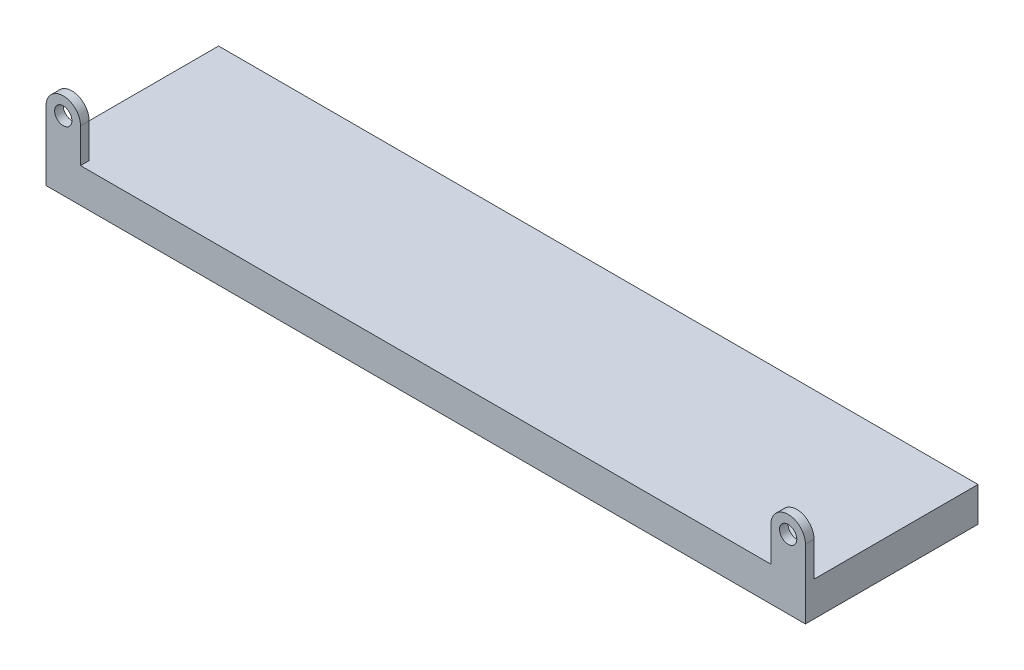
ISO-10303-21;
HEADER;
FILE_DESCRIPTION(('STEP AP214'),'2;1');
FILE_NAME('part.step','',(''),(''),'','','');
FILE_SCHEMA(('AUTOMOTIVE_DESIGN { 1 0 10303 214 1 1 1 1 }'));
ENDSEC;
DATA;
#1=APPLICATION_CONTEXT('core data for automotive mechanical design processes');
#2=APPLICATION_PROTOCOL_DEFINITION('international standard','automotive_design',2000,#1);
#3=PRODUCT_CONTEXT('',#1,'mechanical');
#4=PRODUCT('Part','Part','',(#3));
#5=PRODUCT_RELATED_PRODUCT_CATEGORY('part','',(#4));
#6=PRODUCT_DEFINITION_FORMATION('','',#4);
#7=PRODUCT_DEFINITION_CONTEXT('part definition',#1,'design');
#8=PRODUCT_DEFINITION('design','',#6,#7);
#9=PRODUCT_DEFINITION_SHAPE('','',#8);
#10=(LENGTH_UNIT() NAMED_UNIT(*) SI_UNIT(.MILLI.,.METRE.));
#11=(NAMED_UNIT(*) PLANE_ANGLE_UNIT() SI_UNIT($,.RADIAN.));
#12=(NAMED_UNIT(*) SI_UNIT($,.STERADIAN.) SOLID_ANGLE_UNIT());
#13=UNCERTAINTY_MEASURE_WITH_UNIT(LENGTH_MEASURE(1.E-05),#10,'distance_accuracy_value','');
#14=(GEOMETRIC_REPRESENTATION_CONTEXT(3) GLOBAL_UNCERTAINTY_ASSIGNED_CONTEXT((#13)) GLOBAL_UNIT_ASSIGNED_CONTEXT((#10,
#11,#12)) REPRESENTATION_CONTEXT('',''));
#15=CARTESIAN_POINT('',(0.,0.,0.));
#16=DIRECTION('',(0.,0.,1.));
#17=DIRECTION('',(1.,0.,0.));
#18=AXIS2_PLACEMENT_3D('',#15,#16,#17);
#19=CARTESIAN_POINT('',(-63.5,-127.,-635.));
#20=DIRECTION('',(0.,1.,0.));
#21=DIRECTION('',(0.,0.,1.));
#22=AXIS2_PLACEMENT_3D('',#19,#20,#21);
#23=PLANE('',#22);
#24=DIRECTION('',(0.,0.,1.));
#25=VECTOR('',#24,1.);
#26=CARTESIAN_POINT('',(-63.5,-127.,-635.));
#27=LINE('',#26,#25);
#28=CARTESIAN_POINT('',(-63.5,-127.,-635.));
#29=VERTEX_POINT('',#28);
#30=CARTESIAN_POINT('',(-63.5,-127.,-31.7500000000002));
#31=VERTEX_POINT('',#30);
#32=EDGE_CURVE('E160',#29,#31,#27,.T.);
#33=ORIENTED_EDGE('',*,*,#32,.T.);
#34=DIRECTION('',(1.,0.,0.));
#35=VECTOR('',#34,1.);
#36=CARTESIAN_POINT('',(-63.5,-127.,-31.75));
#37=LINE('',#36,#35);
#38=CARTESIAN_POINT('',(63.5,-127.,-31.7499999999999));
#39=VERTEX_POINT('',#38);
#40=EDGE_CURVE('E52',#31,#39,#37,.T.);
#41=ORIENTED_EDGE('',*,*,#40,.T.);
#42=DIRECTION('',(0.,0.,1.));
#43=VECTOR('',#42,1.);
#44=CARTESIAN_POINT('',(63.5,-127.,-31.75));
#45=LINE('',#44,#43);
#46=CARTESIAN_POINT('',(63.5,-127.,0.));
#47=VERTEX_POINT('',#46);
#48=EDGE_CURVE('E57',#39,#47,#45,.T.);
#49=ORIENTED_EDGE('',*,*,#48,.T.);
#50=DIRECTION('',(-1.,0.,0.));
#51=VECTOR('',#50,1.);
#52=CARTESIAN_POINT('',(-63.5,-127.,0.));
#53=LINE('',#52,#51);
#54=CARTESIAN_POINT('',(2603.5,-127.,0.));
#55=VERTEX_POINT('',#54);
#56=EDGE_CURVE('E149',#55,#47,#53,.T.);
#57=ORIENTED_EDGE('',*,*,#56,.F.);
#58=DIRECTION('',(0.,0.,1.));
#59=VECTOR('',#58,1.);
#60=CARTESIAN_POINT('',(2603.5,-127.,-31.75));
#61=LINE('',#60,#59);
#62=CARTESIAN_POINT('',(2603.5,-127.,-31.75));
#63=VERTEX_POINT('',#62);
#64=EDGE_CURVE('E44',#63,#55,#61,.T.);
#65=ORIENTED_EDGE('',*,*,#64,.F.);
#66=DIRECTION('',(-1.,0.,0.));
#67=VECTOR('',#66,1.);
#68=CARTESIAN_POINT('',(0.,-127.000000000001,-31.75));
#69=LINE('',#68,#67);
#70=CARTESIAN_POINT('',(2730.5,-127.,-31.7500000000002));
#71=VERTEX_POINT('',#70);
#72=EDGE_CURVE('E177',#71,#63,#69,.T.);
#73=ORIENTED_EDGE('',*,*,#72,.F.);
#74=DIRECTION('',(0.,0.,1.));
#75=VECTOR('',#74,1.);
#76=CARTESIAN_POINT('',(2730.5,-127.,-635.));
#77=LINE('',#76,#75);
#78=CARTESIAN_POINT('',(2730.5,-127.,-635.));
#79=VERTEX_POINT('',#78);
#80=EDGE_CURVE('E163',#79,#71,#77,.T.);
#81=ORIENTED_EDGE('',*,*,#80,.F.);
#82=DIRECTION('',(-1.,0.,0.));
#83=VECTOR('',#82,1.);
#84=CARTESIAN_POINT('',(-63.5,-127.,-635.));
#85=LINE('',#84,#83);
#86=EDGE_CURVE('E155',#79,#29,#85,.T.);
#87=ORIENTED_EDGE('',*,*,#86,.T.);
#88=EDGE_LOOP('',(#33,#41,#49,#57,#65,#73,#81,#87));
#89=FACE_BOUND('',#88,.T.);
#90=ADVANCED_FACE('F35',(#89),#23,.T.);
#91=CARTESIAN_POINT('',(2667.,2.61290641066079E-13,-31.75));
#92=DIRECTION('',(0.,0.,1.));
#93=DIRECTION('',(1.,0.,0.));
#94=AXIS2_PLACEMENT_3D('',#91,#92,#93);
#95=CYLINDRICAL_SURFACE('',#94,63.4999999999999);
#96=CARTESIAN_POINT('',(2667.,2.61290641066079E-13,0.));
#97=DIRECTION('',(0.,0.,1.));
#98=DIRECTION('',(1.,0.,0.));
#99=AXIS2_PLACEMENT_3D('',#96,#97,#98);
#100=CIRCLE('',#99,63.4999999999999);
#101=CARTESIAN_POINT('',(2730.5,0.,0.));
#102=VERTEX_POINT('',#101);
#103=CARTESIAN_POINT('',(2603.5,2.55069435326411E-13,0.));
#104=VERTEX_POINT('',#103);
#105=EDGE_CURVE('E162',#102,#104,#100,.T.);
#106=ORIENTED_EDGE('',*,*,#105,.F.);
#107=DIRECTION('',(0.,0.,1.));
#108=VECTOR('',#107,1.);
#109=CARTESIAN_POINT('',(2730.5,0.,-31.75));
#110=LINE('',#109,#108);
#111=CARTESIAN_POINT('',(2730.5,0.,-31.75));
#112=VERTEX_POINT('',#111);
#113=EDGE_CURVE('E11',#112,#102,#110,.T.);
#114=ORIENTED_EDGE('',*,*,#113,.F.);
#115=CARTESIAN_POINT('',(2667.,2.61290641066079E-13,-31.75));
#116=DIRECTION('',(0.,0.,1.));
#117=DIRECTION('',(1.,0.,0.));
#118=AXIS2_PLACEMENT_3D('',#115,#116,#117);
#119=CIRCLE('',#118,63.4999999999999);
#120=CARTESIAN_POINT('',(2603.5,2.55069435326411E-13,-31.75));
#121=VERTEX_POINT('',#120);
#122=EDGE_CURVE('E170',#112,#121,#119,.T.);
#123=ORIENTED_EDGE('',*,*,#122,.T.);
#124=DIRECTION('',(0.,0.,1.));
#125=VECTOR('',#124,1.);
#126=CARTESIAN_POINT('',(2603.5,2.55069435326411E-13,-31.75));
#127=LINE('',#126,#125);
#128=EDGE_CURVE('E183',#121,#104,#127,.T.);
#129=ORIENTED_EDGE('',*,*,#128,.T.);
#130=EDGE_LOOP('',(#106,#114,#123,#129));
#131=FACE_BOUND('',#130,.T.);
#132=ADVANCED_FACE('F37',(#131),#95,.T.);
#133=CARTESIAN_POINT('',(2730.5,0.,-31.75));
#134=DIRECTION('',(-1.,0.,0.));
#135=DIRECTION('',(0.,0.,1.));
#136=AXIS2_PLACEMENT_3D('',#133,#134,#135);
#137=PLANE('',#136);
#138=DIRECTION('',(0.,-1.,0.));
#139=VECTOR('',#138,1.);
#140=CARTESIAN_POINT('',(2730.5,0.,0.));
#141=LINE('',#140,#139);
#142=CARTESIAN_POINT('',(2730.5,-254.,0.));
#143=VERTEX_POINT('',#142);
#144=EDGE_CURVE('E174',#102,#143,#141,.T.);
#145=ORIENTED_EDGE('',*,*,#144,.T.);
#146=DIRECTION('',(0.,0.,1.));
#147=VECTOR('',#146,1.);
#148=CARTESIAN_POINT('',(2730.5,-254.,-635.));
#149=LINE('',#148,#147);
#150=CARTESIAN_POINT('',(2730.5,-254.,-635.));
#151=VERTEX_POINT('',#150);
#152=EDGE_CURVE('E166',#151,#143,#149,.T.);
#153=ORIENTED_EDGE('',*,*,#152,.F.);
#154=DIRECTION('',(0.,1.,0.));
#155=VECTOR('',#154,1.);
#156=CARTESIAN_POINT('',(2730.5,-127.,-635.));
#157=LINE('',#156,#155);
#158=EDGE_CURVE('E152',#151,#79,#157,.T.);
#159=ORIENTED_EDGE('',*,*,#158,.T.);
#160=ORIENTED_EDGE('',*,*,#80,.T.);
#161=DIRECTION('',(0.,-1.,0.));
#162=VECTOR('',#161,1.);
#163=CARTESIAN_POINT('',(2730.5,0.,-31.75));
#164=LINE('',#163,#162);
#165=EDGE_CURVE('E180',#112,#71,#164,.T.);
#166=ORIENTED_EDGE('',*,*,#165,.F.);
#167=ORIENTED_EDGE('',*,*,#113,.T.);
#168=EDGE_LOOP('',(#145,#153,#159,#160,#166,#167));
#169=FACE_BOUND('',#168,.T.);
#170=ADVANCED_FACE('F199',(#169),#137,.F.);
#171=CARTESIAN_POINT('',(2603.5,0.,-31.75));
#172=DIRECTION('',(-1.,0.,0.));
#173=DIRECTION('',(0.,0.,1.));
#174=AXIS2_PLACEMENT_3D('',#171,#172,#173);
#175=PLANE('',#174);
#176=DIRECTION('',(0.,-1.,0.));
#177=VECTOR('',#176,1.);
#178=CARTESIAN_POINT('',(2603.5,0.,0.));
#179=LINE('',#178,#177);
#180=EDGE_CURVE('E185',#104,#55,#179,.T.);
#181=ORIENTED_EDGE('',*,*,#180,.F.);
#182=ORIENTED_EDGE('',*,*,#128,.F.);
#183=DIRECTION('',(0.,-1.,0.));
#184=VECTOR('',#183,1.);
#185=CARTESIAN_POINT('',(2603.5,0.,-31.75));
#186=LINE('',#185,#184);
#187=EDGE_CURVE('E173',#121,#63,#186,.T.);
#188=ORIENTED_EDGE('',*,*,#187,.T.);
#189=ORIENTED_EDGE('',*,*,#64,.T.);
#190=EDGE_LOOP('',(#181,#182,#188,#189));
#191=FACE_BOUND('',#190,.T.);
#192=ADVANCED_FACE('F196',(#191),#175,.T.);
#193=CARTESIAN_POINT('',(0.,0.,-31.75));
#194=DIRECTION('',(0.,0.,1.));
#195=DIRECTION('',(1.,0.,0.));
#196=AXIS2_PLACEMENT_3D('',#193,#194,#195);
#197=PLANE('',#196);
#198=CARTESIAN_POINT('',(2667.,2.61290641066079E-13,-31.7499999999999));
#199=DIRECTION('',(0.,0.,1.));
#200=DIRECTION('',(1.,0.,0.));
#201=AXIS2_PLACEMENT_3D('',#198,#199,#200);
#202=CIRCLE('',#201,31.7500000000004);
#203=CARTESIAN_POINT('',(2698.75,2.61290641066079E-13,-31.7500000000001));
#204=VERTEX_POINT('',#203);
#205=EDGE_CURVE('E134',#204,#204,#202,.T.);
#206=ORIENTED_EDGE('',*,*,#205,.T.);
#207=EDGE_LOOP('',(#206));
#208=FACE_BOUND('',#207,.T.);
#209=ORIENTED_EDGE('',*,*,#122,.F.);
#210=ORIENTED_EDGE('',*,*,#165,.T.);
#211=ORIENTED_EDGE('',*,*,#72,.T.);
#212=ORIENTED_EDGE('',*,*,#187,.F.);
#213=EDGE_LOOP('',(#209,#210,#211,#212));
#214=FACE_BOUND('',#213,.T.);
#215=ADVANCED_FACE('F256',(#208,#214),#197,.F.);
#216=CARTESIAN_POINT('',(0.,0.,0.));
#217=DIRECTION('',(0.,0.,1.));
#218=DIRECTION('',(1.,0.,0.));
#219=AXIS2_PLACEMENT_3D('',#216,#217,#218);
#220=PLANE('',#219);
#221=CARTESIAN_POINT('',(0.,0.,0.));
#222=DIRECTION('',(0.,0.,1.));
#223=DIRECTION('',(1.,0.,0.));
#224=AXIS2_PLACEMENT_3D('',#221,#222,#223);
#225=CIRCLE('',#224,31.75);
#226=CARTESIAN_POINT('',(31.75,0.,-1.11022302462516E-13));
#227=VERTEX_POINT('',#226);
#228=EDGE_CURVE('E225',#227,#227,#225,.T.);
#229=ORIENTED_EDGE('',*,*,#228,.F.);
#230=EDGE_LOOP('',(#229));
#231=FACE_BOUND('',#230,.T.);
#232=CARTESIAN_POINT('',(2667.,2.61290641066079E-13,0.));
#233=DIRECTION('',(0.,0.,1.));
#234=DIRECTION('',(1.,0.,0.));
#235=AXIS2_PLACEMENT_3D('',#232,#233,#234);
#236=CIRCLE('',#235,31.7500000000004);
#237=CARTESIAN_POINT('',(2698.75,2.61290641066079E-13,-1.11022302462516E-13));
#238=VERTEX_POINT('',#237);
#239=EDGE_CURVE('E222',#238,#238,#236,.T.);
#240=ORIENTED_EDGE('',*,*,#239,.F.);
#241=EDGE_LOOP('',(#240));
#242=FACE_BOUND('',#241,.T.);
#243=ORIENTED_EDGE('',*,*,#105,.T.);
#244=ORIENTED_EDGE('',*,*,#180,.T.);
#245=ORIENTED_EDGE('',*,*,#56,.T.);
#246=DIRECTION('',(0.,-1.,0.));
#247=VECTOR('',#246,1.);
#248=CARTESIAN_POINT('',(63.5,0.,0.));
#249=LINE('',#248,#247);
#250=CARTESIAN_POINT('',(63.5,0.,0.));
#251=VERTEX_POINT('',#250);
#252=EDGE_CURVE('E124',#251,#47,#249,.T.);
#253=ORIENTED_EDGE('',*,*,#252,.F.);
#254=CARTESIAN_POINT('',(0.,0.,0.));
#255=DIRECTION('',(0.,0.,1.));
#256=DIRECTION('',(1.,0.,0.));
#257=AXIS2_PLACEMENT_3D('',#254,#255,#256);
#258=CIRCLE('',#257,63.5);
#259=CARTESIAN_POINT('',(-63.5,0.,0.));
#260=VERTEX_POINT('',#259);
#261=EDGE_CURVE('E130',#251,#260,#258,.T.);
#262=ORIENTED_EDGE('',*,*,#261,.T.);
#263=DIRECTION('',(0.,-1.,0.));
#264=VECTOR('',#263,1.);
#265=CARTESIAN_POINT('',(-63.5,-127.,0.));
#266=LINE('',#265,#264);
#267=CARTESIAN_POINT('',(-63.5,-254.,0.));
#268=VERTEX_POINT('',#267);
#269=EDGE_CURVE('E111',#260,#268,#266,.T.);
#270=ORIENTED_EDGE('',*,*,#269,.T.);
#271=DIRECTION('',(1.,0.,0.));
#272=VECTOR('',#271,1.);
#273=CARTESIAN_POINT('',(-63.5,-254.,0.));
#274=LINE('',#273,#272);
#275=EDGE_CURVE('E123',#268,#143,#274,.T.);
#276=ORIENTED_EDGE('',*,*,#275,.T.);
#277=ORIENTED_EDGE('',*,*,#144,.F.);
#278=EDGE_LOOP('',(#243,#244,#245,#253,#262,#270,#276,#277));
#279=FACE_BOUND('',#278,.T.);
#280=ADVANCED_FACE('F138',(#231,#242,#279),#220,.T.);
#281=CARTESIAN_POINT('',(-63.5,-127.,-635.));
#282=DIRECTION('',(-1.,0.,0.));
#283=DIRECTION('',(0.,-1.,0.));
#284=AXIS2_PLACEMENT_3D('',#281,#282,#283);
#285=PLANE('',#284);
#286=ORIENTED_EDGE('',*,*,#269,.F.);
#287=DIRECTION('',(0.,0.,1.));
#288=VECTOR('',#287,1.);
#289=CARTESIAN_POINT('',(-63.5,0.,-31.75));
#290=LINE('',#289,#288);
#291=CARTESIAN_POINT('',(-63.5,0.,-31.75));
#292=VERTEX_POINT('',#291);
#293=EDGE_CURVE('E115',#292,#260,#290,.T.);
#294=ORIENTED_EDGE('',*,*,#293,.F.);
#295=DIRECTION('',(0.,-1.,0.));
#296=VECTOR('',#295,1.);
#297=CARTESIAN_POINT('',(-63.5,0.,-31.75));
#298=LINE('',#297,#296);
#299=EDGE_CURVE('E141',#292,#31,#298,.T.);
#300=ORIENTED_EDGE('',*,*,#299,.T.);
#301=ORIENTED_EDGE('',*,*,#32,.F.);
#302=DIRECTION('',(0.,-1.,0.));
#303=VECTOR('',#302,1.);
#304=CARTESIAN_POINT('',(-63.5,-127.,-635.));
#305=LINE('',#304,#303);
#306=CARTESIAN_POINT('',(-63.5,-254.,-635.));
#307=VERTEX_POINT('',#306);
#308=EDGE_CURVE('E146',#29,#307,#305,.T.);
#309=ORIENTED_EDGE('',*,*,#308,.T.);
#310=DIRECTION('',(0.,0.,1.));
#311=VECTOR('',#310,1.);
#312=CARTESIAN_POINT('',(-63.5,-254.,-635.));
#313=LINE('',#312,#311);
#314=EDGE_CURVE('E118',#307,#268,#313,.T.);
#315=ORIENTED_EDGE('',*,*,#314,.T.);
#316=EDGE_LOOP('',(#286,#294,#300,#301,#309,#315));
#317=FACE_BOUND('',#316,.T.);
#318=ADVANCED_FACE('F113',(#317),#285,.T.);
#319=CARTESIAN_POINT('',(-63.5,-254.,-635.));
#320=DIRECTION('',(0.,-1.,0.));
#321=DIRECTION('',(0.,0.,-1.));
#322=AXIS2_PLACEMENT_3D('',#319,#320,#321);
#323=PLANE('',#322);
#324=ORIENTED_EDGE('',*,*,#275,.F.);
#325=ORIENTED_EDGE('',*,*,#314,.F.);
#326=DIRECTION('',(1.,0.,0.));
#327=VECTOR('',#326,1.);
#328=CARTESIAN_POINT('',(-63.5,-254.,-635.));
#329=LINE('',#328,#327);
#330=EDGE_CURVE('E148',#307,#151,#329,.T.);
#331=ORIENTED_EDGE('',*,*,#330,.T.);
#332=ORIENTED_EDGE('',*,*,#152,.T.);
#333=EDGE_LOOP('',(#324,#325,#331,#332));
#334=FACE_BOUND('',#333,.T.);
#335=ADVANCED_FACE('F203',(#334),#323,.T.);
#336=CARTESIAN_POINT('',(0.,0.,-635.));
#337=DIRECTION('',(0.,0.,1.));
#338=DIRECTION('',(1.,0.,0.));
#339=AXIS2_PLACEMENT_3D('',#336,#337,#338);
#340=PLANE('',#339);
#341=ORIENTED_EDGE('',*,*,#308,.F.);
#342=ORIENTED_EDGE('',*,*,#86,.F.);
#343=ORIENTED_EDGE('',*,*,#158,.F.);
#344=ORIENTED_EDGE('',*,*,#330,.F.);
#345=EDGE_LOOP('',(#341,#342,#343,#344));
#346=FACE_BOUND('',#345,.T.);
#347=ADVANCED_FACE('F207',(#346),#340,.F.);
#348=CARTESIAN_POINT('',(0.,0.,-31.75));
#349=DIRECTION('',(0.,0.,1.));
#350=DIRECTION('',(1.,0.,0.));
#351=AXIS2_PLACEMENT_3D('',#348,#349,#350);
#352=CYLINDRICAL_SURFACE('',#351,63.5);
#353=ORIENTED_EDGE('',*,*,#261,.F.);
#354=DIRECTION('',(0.,0.,1.));
#355=VECTOR('',#354,1.);
#356=CARTESIAN_POINT('',(63.5,0.,-31.75));
#357=LINE('',#356,#355);
#358=CARTESIAN_POINT('',(63.5,0.,-31.75));
#359=VERTEX_POINT('',#358);
#360=EDGE_CURVE('E133',#359,#251,#357,.T.);
#361=ORIENTED_EDGE('',*,*,#360,.F.);
#362=CARTESIAN_POINT('',(0.,0.,-31.75));
#363=DIRECTION('',(0.,0.,1.));
#364=DIRECTION('',(1.,0.,0.));
#365=AXIS2_PLACEMENT_3D('',#362,#363,#364);
#366=CIRCLE('',#365,63.5);
#367=EDGE_CURVE('E132',#359,#292,#366,.T.);
#368=ORIENTED_EDGE('',*,*,#367,.T.);
#369=ORIENTED_EDGE('',*,*,#293,.T.);
#370=EDGE_LOOP('',(#353,#361,#368,#369));
#371=FACE_BOUND('',#370,.T.);
#372=ADVANCED_FACE('F129',(#371),#352,.T.);
#373=CARTESIAN_POINT('',(0.,0.,-31.75));
#374=DIRECTION('',(0.,0.,1.));
#375=DIRECTION('',(1.,0.,0.));
#376=AXIS2_PLACEMENT_3D('',#373,#374,#375);
#377=PLANE('',#376);
#378=CARTESIAN_POINT('',(0.,0.,-31.7499999999999));
#379=DIRECTION('',(0.,0.,1.));
#380=DIRECTION('',(1.,0.,0.));
#381=AXIS2_PLACEMENT_3D('',#378,#379,#380);
#382=CIRCLE('',#381,31.75);
#383=CARTESIAN_POINT('',(31.75,0.,-31.7500000000001));
#384=VERTEX_POINT('',#383);
#385=EDGE_CURVE('E39',#384,#384,#382,.T.);
#386=ORIENTED_EDGE('',*,*,#385,.T.);
#387=EDGE_LOOP('',(#386));
#388=FACE_BOUND('',#387,.T.);
#389=ORIENTED_EDGE('',*,*,#367,.F.);
#390=DIRECTION('',(0.,-1.,0.));
#391=VECTOR('',#390,1.);
#392=CARTESIAN_POINT('',(63.5,0.,-31.75));
#393=LINE('',#392,#391);
#394=EDGE_CURVE('E212',#359,#39,#393,.T.);
#395=ORIENTED_EDGE('',*,*,#394,.T.);
#396=ORIENTED_EDGE('',*,*,#40,.F.);
#397=ORIENTED_EDGE('',*,*,#299,.F.);
#398=EDGE_LOOP('',(#389,#395,#396,#397));
#399=FACE_BOUND('',#398,.T.);
#400=ADVANCED_FACE('F210',(#388,#399),#377,.F.);
#401=CARTESIAN_POINT('',(63.5,0.,-31.75));
#402=DIRECTION('',(-1.,0.,0.));
#403=DIRECTION('',(0.,-1.,0.));
#404=AXIS2_PLACEMENT_3D('',#401,#402,#403);
#405=PLANE('',#404);
#406=ORIENTED_EDGE('',*,*,#252,.T.);
#407=ORIENTED_EDGE('',*,*,#48,.F.);
#408=ORIENTED_EDGE('',*,*,#394,.F.);
#409=ORIENTED_EDGE('',*,*,#360,.T.);
#410=EDGE_LOOP('',(#406,#407,#408,#409));
#411=FACE_BOUND('',#410,.T.);
#412=ADVANCED_FACE('F218',(#411),#405,.F.);
#413=CARTESIAN_POINT('',(0.,0.,-635.));
#414=DIRECTION('',(0.,0.,1.));
#415=DIRECTION('',(1.,0.,0.));
#416=AXIS2_PLACEMENT_3D('',#413,#414,#415);
#417=CYLINDRICAL_SURFACE('',#416,31.75);
#418=CARTESIAN_POINT('',(31.75,0.,-1.11022302462516E-13));
#419=CARTESIAN_POINT('',(31.75,0.,-0.330729166666765));
#420=CARTESIAN_POINT('',(31.75,0.,-0.66145833333342));
#421=CARTESIAN_POINT('',(31.75,0.,-1.32291666666677));
#422=CARTESIAN_POINT('',(31.75,0.,-1.65364583333346));
#423=CARTESIAN_POINT('',(31.75,0.,-2.3151041666668));
#424=CARTESIAN_POINT('',(31.75,0.,-2.64583333333346));
#425=CARTESIAN_POINT('',(31.75,0.,-3.30729166666677));
#426=CARTESIAN_POINT('',(31.75,0.,-3.63802083333342));
#427=CARTESIAN_POINT('',(31.75,0.,-4.29947916666677));
#428=CARTESIAN_POINT('',(31.75,0.,-4.63020833333346));
#429=CARTESIAN_POINT('',(31.75,0.,-5.29166666666681));
#430=CARTESIAN_POINT('',(31.75,0.,-5.62239583333346));
#431=CARTESIAN_POINT('',(31.75,0.,-6.28385416666677));
#432=CARTESIAN_POINT('',(31.75,0.,-6.61458333333342));
#433=CARTESIAN_POINT('',(31.75,0.,-7.27604166666673));
#434=CARTESIAN_POINT('',(31.75,0.,-7.60677083333339));
#435=CARTESIAN_POINT('',(31.75,0.,-8.26822916666673));
#436=CARTESIAN_POINT('',(31.75,0.,-8.59895833333342));
#437=CARTESIAN_POINT('',(31.75,0.,-9.26041666666677));
#438=CARTESIAN_POINT('',(31.75,0.,-9.59114583333342));
#439=CARTESIAN_POINT('',(31.75,0.,-10.2526041666667));
#440=CARTESIAN_POINT('',(31.75,0.,-10.5833333333334));
#441=CARTESIAN_POINT('',(31.75,0.,-11.2447916666667));
#442=CARTESIAN_POINT('',(31.75,0.,-11.5755208333334));
#443=CARTESIAN_POINT('',(31.75,0.,-12.2369791666668));
#444=CARTESIAN_POINT('',(31.75,0.,-12.5677083333334));
#445=CARTESIAN_POINT('',(31.75,0.,-13.2291666666667));
#446=CARTESIAN_POINT('',(31.75,0.,-13.5598958333334));
#447=CARTESIAN_POINT('',(31.75,0.,-14.2213541666667));
#448=CARTESIAN_POINT('',(31.75,0.,-14.5520833333334));
#449=CARTESIAN_POINT('',(31.75,0.,-15.2135416666668));
#450=CARTESIAN_POINT('',(31.75,0.,-15.5442708333334));
#451=CARTESIAN_POINT('',(31.75,0.,-16.2057291666667));
#452=CARTESIAN_POINT('',(31.75,0.,-16.5364583333334));
#453=CARTESIAN_POINT('',(31.75,0.,-17.1979166666667));
#454=CARTESIAN_POINT('',(31.75,0.,-17.5286458333334));
#455=CARTESIAN_POINT('',(31.75,0.,-18.1901041666668));
#456=CARTESIAN_POINT('',(31.75,0.,-18.5208333333334));
#457=CARTESIAN_POINT('',(31.75,0.,-19.1822916666667));
#458=CARTESIAN_POINT('',(31.75,0.,-19.5130208333334));
#459=CARTESIAN_POINT('',(31.75,0.,-20.1744791666667));
#460=CARTESIAN_POINT('',(31.75,0.,-20.5052083333334));
#461=CARTESIAN_POINT('',(31.75,0.,-21.1666666666668));
#462=CARTESIAN_POINT('',(31.75,0.,-21.4973958333334));
#463=CARTESIAN_POINT('',(31.75,0.,-22.1588541666667));
#464=CARTESIAN_POINT('',(31.75,0.,-22.4895833333334));
#465=CARTESIAN_POINT('',(31.75,0.,-23.1510416666667));
#466=CARTESIAN_POINT('',(31.75,0.,-23.4817708333334));
#467=CARTESIAN_POINT('',(31.75,0.,-24.1432291666668));
#468=CARTESIAN_POINT('',(31.75,0.,-24.4739583333334));
#469=CARTESIAN_POINT('',(31.75,0.,-25.1354166666667));
#470=CARTESIAN_POINT('',(31.75,0.,-25.4661458333334));
#471=CARTESIAN_POINT('',(31.75,0.,-26.1276041666667));
#472=CARTESIAN_POINT('',(31.75,0.,-26.4583333333334));
#473=CARTESIAN_POINT('',(31.75,0.,-27.1197916666667));
#474=CARTESIAN_POINT('',(31.75,0.,-27.4505208333334));
#475=CARTESIAN_POINT('',(31.75,0.,-28.1119791666667));
#476=CARTESIAN_POINT('',(31.75,0.,-28.4427083333334));
#477=CARTESIAN_POINT('',(31.75,0.,-29.1041666666667));
#478=CARTESIAN_POINT('',(31.75,0.,-29.4348958333334));
#479=CARTESIAN_POINT('',(31.75,0.,-30.0963541666667));
#480=CARTESIAN_POINT('',(31.75,0.,-30.4270833333334));
#481=CARTESIAN_POINT('',(31.75,0.,-31.0885416666667));
#482=CARTESIAN_POINT('',(31.75,0.,-31.4192708333334));
#483=CARTESIAN_POINT('',(31.75,0.,-31.7500000000001));
#484=B_SPLINE_CURVE_WITH_KNOTS('',3,(#418,#419,#420,#421,#422,#423,#424,#425,#426,#427,#428,
#429,#430,#431,#432,#433,#434,#435,#436,#437,#438,#439,#440,#441,#442,#443,#444,#445,#446,#447,
#448,#449,#450,#451,#452,#453,#454,#455,#456,#457,#458,#459,#460,#461,#462,#463,#464,#465,#466,
#467,#468,#469,#470,#471,#472,#473,#474,#475,#476,#477,#478,#479,#480,#481,#482,#483),
.UNSPECIFIED.,.F.,.F.,(4,2,2,2,2,2,2,2,2,2,2,2,2,2,2,2,2,2,2,2,2,2,2,2,2,2,2,2,2,2,2,2,4),(0.,
0.992187499999964,1.98437500000004,2.9765625,3.96874999999997,4.96093750000004,5.953125,
6.94531249999997,7.93749999999993,8.92968750000001,9.92187499999997,10.9140624999999,11.90625,
12.8984375,13.8906249999999,14.8828125,15.875,16.8671874999999,17.859375,18.8515625,
19.8437499999999,20.8359375,21.828125,22.8203124999999,23.8125,24.8046875,25.7968749999999,
26.7890624999999,27.78125,28.7734374999999,29.7656249999999,30.7578125,31.7499999999999),.UNSPECIFIED.);
#485=EDGE_CURVE('BSEAM233',#227,#384,#484,.T.);
#486=ORIENTED_EDGE('',*,*,#228,.T.);
#487=ORIENTED_EDGE('',*,*,#385,.F.);
#488=ORIENTED_EDGE('',*,*,#485,.T.);
#489=ORIENTED_EDGE('',*,*,#485,.F.);
#490=EDGE_LOOP('',(#486,#488,#487,#489));
#491=FACE_BOUND('',#490,.T.);
#492=ADVANCED_FACE('F233',(#491),#417,.F.);
#493=CARTESIAN_POINT('',(2667.,2.61290641066079E-13,-635.));
#494=DIRECTION('',(0.,0.,1.));
#495=DIRECTION('',(1.,0.,0.));
#496=AXIS2_PLACEMENT_3D('',#493,#494,#495);
#497=CYLINDRICAL_SURFACE('',#496,31.7500000000004);
#498=CARTESIAN_POINT('',(2698.75,2.61290641066079E-13,-1.11022302462516E-13));
#499=CARTESIAN_POINT('',(2698.75,2.61290641066079E-13,-0.330729166666765));
#500=CARTESIAN_POINT('',(2698.75,2.61290641066079E-13,-0.66145833333342));
#501=CARTESIAN_POINT('',(2698.75,2.61290641066079E-13,-1.32291666666677));
#502=CARTESIAN_POINT('',(2698.75,2.61290641066079E-13,-1.65364583333346));
#503=CARTESIAN_POINT('',(2698.75,2.61290641066079E-13,-2.3151041666668));
#504=CARTESIAN_POINT('',(2698.75,2.61290641066079E-13,-2.64583333333346));
#505=CARTESIAN_POINT('',(2698.75,2.61290641066079E-13,-3.30729166666677));
#506=CARTESIAN_POINT('',(2698.75,2.61290641066079E-13,-3.63802083333342));
#507=CARTESIAN_POINT('',(2698.75,2.61290641066079E-13,-4.29947916666677));
#508=CARTESIAN_POINT('',(2698.75,2.61290641066079E-13,-4.63020833333346));
#509=CARTESIAN_POINT('',(2698.75,2.61290641066079E-13,-5.29166666666681));
#510=CARTESIAN_POINT('',(2698.75,2.61290641066079E-13,-5.62239583333346));
#511=CARTESIAN_POINT('',(2698.75,2.61290641066079E-13,-6.28385416666677));
#512=CARTESIAN_POINT('',(2698.75,2.61290641066079E-13,-6.61458333333342));
#513=CARTESIAN_POINT('',(2698.75,2.61290641066079E-13,-7.27604166666673));
#514=CARTESIAN_POINT('',(2698.75,2.61290641066079E-13,-7.60677083333339));
#515=CARTESIAN_POINT('',(2698.75,2.61290641066079E-13,-8.26822916666673));
#516=CARTESIAN_POINT('',(2698.75,2.61290641066079E-13,-8.59895833333342));
#517=CARTESIAN_POINT('',(2698.75,2.61290641066079E-13,-9.26041666666677));
#518=CARTESIAN_POINT('',(2698.75,2.61290641066079E-13,-9.59114583333342));
#519=CARTESIAN_POINT('',(2698.75,2.61290641066079E-13,-10.2526041666667));
#520=CARTESIAN_POINT('',(2698.75,2.61290641066079E-13,-10.5833333333334));
#521=CARTESIAN_POINT('',(2698.75,2.61290641066079E-13,-11.2447916666667));
#522=CARTESIAN_POINT('',(2698.75,2.61290641066079E-13,-11.5755208333334));
#523=CARTESIAN_POINT('',(2698.75,2.61290641066079E-13,-12.2369791666668));
#524=CARTESIAN_POINT('',(2698.75,2.61290641066079E-13,-12.5677083333334));
#525=CARTESIAN_POINT('',(2698.75,2.61290641066079E-13,-13.2291666666667));
#526=CARTESIAN_POINT('',(2698.75,2.61290641066079E-13,-13.5598958333334));
#527=CARTESIAN_POINT('',(2698.75,2.61290641066079E-13,-14.2213541666667));
#528=CARTESIAN_POINT('',(2698.75,2.61290641066079E-13,-14.5520833333334));
#529=CARTESIAN_POINT('',(2698.75,2.61290641066079E-13,-15.2135416666668));
#530=CARTESIAN_POINT('',(2698.75,2.61290641066079E-13,-15.5442708333334));
#531=CARTESIAN_POINT('',(2698.75,2.61290641066079E-13,-16.2057291666667));
#532=CARTESIAN_POINT('',(2698.75,2.61290641066079E-13,-16.5364583333334));
#533=CARTESIAN_POINT('',(2698.75,2.61290641066079E-13,-17.1979166666667));
#534=CARTESIAN_POINT('',(2698.75,2.61290641066079E-13,-17.5286458333334));
#535=CARTESIAN_POINT('',(2698.75,2.61290641066079E-13,-18.1901041666668));
#536=CARTESIAN_POINT('',(2698.75,2.61290641066079E-13,-18.5208333333334));
#537=CARTESIAN_POINT('',(2698.75,2.61290641066079E-13,-19.1822916666667));
#538=CARTESIAN_POINT('',(2698.75,2.61290641066079E-13,-19.5130208333334));
#539=CARTESIAN_POINT('',(2698.75,2.61290641066079E-13,-20.1744791666667));
#540=CARTESIAN_POINT('',(2698.75,2.61290641066079E-13,-20.5052083333334));
#541=CARTESIAN_POINT('',(2698.75,2.61290641066079E-13,-21.1666666666668));
#542=CARTESIAN_POINT('',(2698.75,2.61290641066079E-13,-21.4973958333334));
#543=CARTESIAN_POINT('',(2698.75,2.61290641066079E-13,-22.1588541666667));
#544=CARTESIAN_POINT('',(2698.75,2.61290641066079E-13,-22.4895833333334));
#545=CARTESIAN_POINT('',(2698.75,2.61290641066079E-13,-23.1510416666667));
#546=CARTESIAN_POINT('',(2698.75,2.61290641066079E-13,-23.4817708333334));
#547=CARTESIAN_POINT('',(2698.75,2.61290641066079E-13,-24.1432291666668));
#548=CARTESIAN_POINT('',(2698.75,2.61290641066079E-13,-24.4739583333334));
#549=CARTESIAN_POINT('',(2698.75,2.61290641066079E-13,-25.1354166666667));
#550=CARTESIAN_POINT('',(2698.75,2.61290641066079E-13,-25.4661458333334));
#551=CARTESIAN_POINT('',(2698.75,2.61290641066079E-13,-26.1276041666667));
#552=CARTESIAN_POINT('',(2698.75,2.61290641066079E-13,-26.4583333333334));
#553=CARTESIAN_POINT('',(2698.75,2.61290641066079E-13,-27.1197916666667));
#554=CARTESIAN_POINT('',(2698.75,2.61290641066079E-13,-27.4505208333334));
#555=CARTESIAN_POINT('',(2698.75,2.61290641066079E-13,-28.1119791666667));
#556=CARTESIAN_POINT('',(2698.75,2.61290641066079E-13,-28.4427083333334));
#557=CARTESIAN_POINT('',(2698.75,2.61290641066079E-13,-29.1041666666667));
#558=CARTESIAN_POINT('',(2698.75,2.61290641066079E-13,-29.4348958333334));
#559=CARTESIAN_POINT('',(2698.75,2.61290641066079E-13,-30.0963541666667));
#560=CARTESIAN_POINT('',(2698.75,2.61290641066079E-13,-30.4270833333334));
#561=CARTESIAN_POINT('',(2698.75,2.61290641066079E-13,-31.0885416666667));
#562=CARTESIAN_POINT('',(2698.75,2.61290641066079E-13,-31.4192708333334));
#563=CARTESIAN_POINT('',(2698.75,2.61290641066079E-13,-31.7500000000001));
#564=B_SPLINE_CURVE_WITH_KNOTS('',3,(#498,#499,#500,#501,#502,#503,#504,#505,#506,#507,#508,
#509,#510,#511,#512,#513,#514,#515,#516,#517,#518,#519,#520,#521,#522,#523,#524,#525,#526,#527,
#528,#529,#530,#531,#532,#533,#534,#535,#536,#537,#538,#539,#540,#541,#542,#543,#544,#545,#546,
#547,#548,#549,#550,#551,#552,#553,#554,#555,#556,#557,#558,#559,#560,#561,#562,#563),
.UNSPECIFIED.,.F.,.F.,(4,2,2,2,2,2,2,2,2,2,2,2,2,2,2,2,2,2,2,2,2,2,2,2,2,2,2,2,2,2,2,2,4),(0.,
0.992187499999964,1.98437500000004,2.9765625,3.96874999999997,4.96093750000004,5.953125,
6.94531249999997,7.93749999999993,8.92968750000001,9.92187499999997,10.9140624999999,11.90625,
12.8984375,13.8906249999999,14.8828125,15.875,16.8671874999999,17.859375,18.8515625,
19.8437499999999,20.8359375,21.828125,22.8203124999999,23.8125,24.8046875,25.7968749999999,
26.7890624999999,27.78125,28.7734374999999,29.7656249999999,30.7578125,31.7499999999999),.UNSPECIFIED.);
#565=EDGE_CURVE('BSEAM235',#238,#204,#564,.T.);
#566=ORIENTED_EDGE('',*,*,#239,.T.);
#567=ORIENTED_EDGE('',*,*,#205,.F.);
#568=ORIENTED_EDGE('',*,*,#565,.T.);
#569=ORIENTED_EDGE('',*,*,#565,.F.);
#570=EDGE_LOOP('',(#566,#568,#567,#569));
#571=FACE_BOUND('',#570,.T.);
#572=ADVANCED_FACE('F235',(#571),#497,.F.);
#573=CLOSED_SHELL('',(#90,#132,#170,#192,#215,#280,#318,#335,#347,#372,#400,#412,#492,#572));
#574=MANIFOLD_SOLID_BREP('B2',#573);
#575=ADVANCED_BREP_SHAPE_REPRESENTATION('',(#18,#574),#14);
#576=SHAPE_DEFINITION_REPRESENTATION(#9,#575);
ENDSEC;
END-ISO-10303-21;
